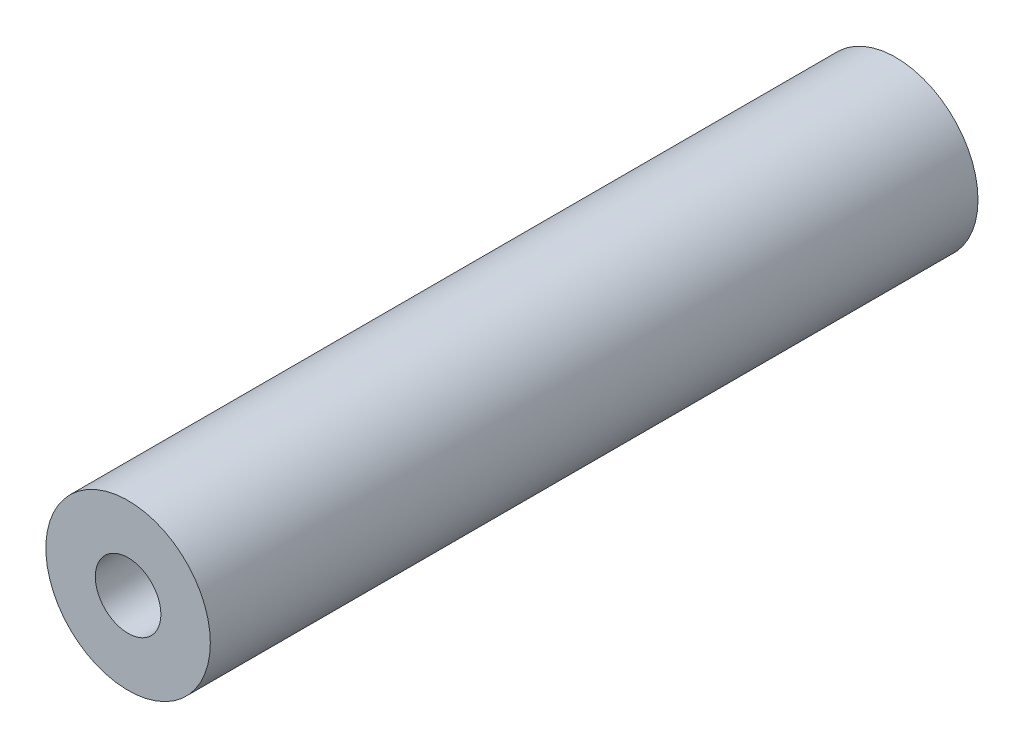
ISO-10303-21;
HEADER;
FILE_DESCRIPTION(('STEP AP214'),'2;1');
FILE_NAME('part.step','',(''),(''),'','','');
FILE_SCHEMA(('AUTOMOTIVE_DESIGN { 1 0 10303 214 1 1 1 1 }'));
ENDSEC;
DATA;
#1=APPLICATION_CONTEXT('core data for automotive mechanical design processes');
#2=APPLICATION_PROTOCOL_DEFINITION('international standard','automotive_design',2000,#1);
#3=PRODUCT_CONTEXT('',#1,'mechanical');
#4=PRODUCT('Part','Part','',(#3));
#5=PRODUCT_RELATED_PRODUCT_CATEGORY('part','',(#4));
#6=PRODUCT_DEFINITION_FORMATION('','',#4);
#7=PRODUCT_DEFINITION_CONTEXT('part definition',#1,'design');
#8=PRODUCT_DEFINITION('design','',#6,#7);
#9=PRODUCT_DEFINITION_SHAPE('','',#8);
#10=(LENGTH_UNIT() NAMED_UNIT(*) SI_UNIT(.MILLI.,.METRE.));
#11=(NAMED_UNIT(*) PLANE_ANGLE_UNIT() SI_UNIT($,.RADIAN.));
#12=(NAMED_UNIT(*) SI_UNIT($,.STERADIAN.) SOLID_ANGLE_UNIT());
#13=UNCERTAINTY_MEASURE_WITH_UNIT(LENGTH_MEASURE(1.E-05),#10,'distance_accuracy_value','');
#14=(GEOMETRIC_REPRESENTATION_CONTEXT(3) GLOBAL_UNCERTAINTY_ASSIGNED_CONTEXT((#13)) GLOBAL_UNIT_ASSIGNED_CONTEXT((#10,
#11,#12)) REPRESENTATION_CONTEXT('',''));
#15=CARTESIAN_POINT('',(0.,0.,0.));
#16=DIRECTION('',(0.,0.,1.));
#17=DIRECTION('',(1.,0.,0.));
#18=AXIS2_PLACEMENT_3D('',#15,#16,#17);
#19=CARTESIAN_POINT('',(0.,0.,22.225));
#20=DIRECTION('',(0.,0.,-1.));
#21=DIRECTION('',(-1.,0.,0.));
#22=AXIS2_PLACEMENT_3D('',#19,#20,#21);
#23=CYLINDRICAL_SURFACE('',#22,4.7625);
#24=CARTESIAN_POINT('',(0.,0.,22.225));
#25=DIRECTION('',(0.,0.,1.));
#26=DIRECTION('',(1.,0.,0.));
#27=AXIS2_PLACEMENT_3D('',#24,#25,#26);
#28=CIRCLE('',#27,4.7625);
#29=CARTESIAN_POINT('',(4.7625,0.,22.225));
#30=VERTEX_POINT('',#29);
#31=EDGE_CURVE('E11',#30,#30,#28,.T.);
#32=ORIENTED_EDGE('',*,*,#31,.F.);
#33=EDGE_LOOP('',(#32));
#34=FACE_BOUND('',#33,.T.);
#35=CARTESIAN_POINT('',(0.,0.,-22.225));
#36=DIRECTION('',(0.,0.,1.));
#37=DIRECTION('',(1.,0.,0.));
#38=AXIS2_PLACEMENT_3D('',#35,#36,#37);
#39=CIRCLE('',#38,4.7625);
#40=CARTESIAN_POINT('',(4.7625,0.,-22.225));
#41=VERTEX_POINT('',#40);
#42=EDGE_CURVE('E48',#41,#41,#39,.T.);
#43=ORIENTED_EDGE('',*,*,#42,.T.);
#44=EDGE_LOOP('',(#43));
#45=FACE_BOUND('',#44,.T.);
#46=ADVANCED_FACE('F45',(#34,#45),#23,.T.);
#47=CARTESIAN_POINT('',(0.,0.,22.225));
#48=DIRECTION('',(0.,0.,1.));
#49=DIRECTION('',(1.,0.,0.));
#50=AXIS2_PLACEMENT_3D('',#47,#48,#49);
#51=PLANE('',#50);
#52=CARTESIAN_POINT('',(0.,0.,22.225));
#53=DIRECTION('',(0.,0.,1.));
#54=DIRECTION('',(1.,0.,0.));
#55=AXIS2_PLACEMENT_3D('',#52,#53,#54);
#56=CIRCLE('',#55,1.89864999999999);
#57=CARTESIAN_POINT('',(1.89864999999999,0.,22.225));
#58=VERTEX_POINT('',#57);
#59=EDGE_CURVE('E71',#58,#58,#56,.T.);
#60=ORIENTED_EDGE('',*,*,#59,.F.);
#61=EDGE_LOOP('',(#60));
#62=FACE_BOUND('',#61,.T.);
#63=ORIENTED_EDGE('',*,*,#31,.T.);
#64=EDGE_LOOP('',(#63));
#65=FACE_BOUND('',#64,.T.);
#66=ADVANCED_FACE('F93',(#62,#65),#51,.T.);
#67=CARTESIAN_POINT('',(0.,0.,-22.225));
#68=DIRECTION('',(0.,0.,1.));
#69=DIRECTION('',(1.,0.,0.));
#70=AXIS2_PLACEMENT_3D('',#67,#68,#69);
#71=PLANE('',#70);
#72=CARTESIAN_POINT('',(0.,0.,-22.225));
#73=DIRECTION('',(0.,0.,-1.));
#74=DIRECTION('',(-1.,0.,0.));
#75=AXIS2_PLACEMENT_3D('',#72,#73,#74);
#76=CIRCLE('',#75,1.89864999999999);
#77=CARTESIAN_POINT('',(-1.89864999999999,0.,-22.225));
#78=VERTEX_POINT('',#77);
#79=EDGE_CURVE('E70',#78,#78,#76,.T.);
#80=ORIENTED_EDGE('',*,*,#79,.F.);
#81=EDGE_LOOP('',(#80));
#82=FACE_BOUND('',#81,.T.);
#83=ORIENTED_EDGE('',*,*,#42,.F.);
#84=EDGE_LOOP('',(#83));
#85=FACE_BOUND('',#84,.T.);
#86=ADVANCED_FACE('F90',(#82,#85),#71,.F.);
#87=CARTESIAN_POINT('',(0.,0.,-9.271));
#88=DIRECTION('',(0.,0.,-1.));
#89=DIRECTION('',(-1.,0.,0.));
#90=AXIS2_PLACEMENT_3D('',#87,#88,#89);
#91=CONICAL_SURFACE('',#90,1.89864999999999,1.02974425867665);
#92=CARTESIAN_POINT('',(0.,0.,-8.13017598568333));
#93=VERTEX_POINT('',#92);
#94=VERTEX_LOOP('',#93);
#95=FACE_BOUND('',#94,.T.);
#96=CARTESIAN_POINT('',(0.,0.,-9.271));
#97=DIRECTION('',(0.,0.,-1.));
#98=DIRECTION('',(-1.,0.,0.));
#99=AXIS2_PLACEMENT_3D('',#96,#97,#98);
#100=CIRCLE('',#99,1.89864999999999);
#101=CARTESIAN_POINT('',(-1.89864999999999,0.,-9.271));
#102=VERTEX_POINT('',#101);
#103=EDGE_CURVE('E76',#102,#102,#100,.T.);
#104=ORIENTED_EDGE('',*,*,#103,.T.);
#105=EDGE_LOOP('',(#104));
#106=FACE_BOUND('',#105,.T.);
#107=ADVANCED_FACE('F92',(#95,#106),#91,.F.);
#108=CARTESIAN_POINT('',(0.,0.,-22.225));
#109=DIRECTION('',(0.,0.,-1.));
#110=DIRECTION('',(-1.,0.,0.));
#111=AXIS2_PLACEMENT_3D('',#108,#109,#110);
#112=CYLINDRICAL_SURFACE('',#111,1.89864999999999);
#113=ORIENTED_EDGE('',*,*,#103,.F.);
#114=EDGE_LOOP('',(#113));
#115=FACE_BOUND('',#114,.T.);
#116=ORIENTED_EDGE('',*,*,#79,.T.);
#117=EDGE_LOOP('',(#116));
#118=FACE_BOUND('',#117,.T.);
#119=ADVANCED_FACE('F63',(#115,#118),#112,.F.);
#120=CARTESIAN_POINT('',(0.,0.,9.271));
#121=DIRECTION('',(0.,0.,1.));
#122=DIRECTION('',(1.,0.,0.));
#123=AXIS2_PLACEMENT_3D('',#120,#121,#122);
#124=CONICAL_SURFACE('',#123,1.89864999999999,1.02974425867665);
#125=CARTESIAN_POINT('',(0.,0.,8.13017598568333));
#126=VERTEX_POINT('',#125);
#127=VERTEX_LOOP('',#126);
#128=FACE_BOUND('',#127,.T.);
#129=CARTESIAN_POINT('',(0.,0.,9.271));
#130=DIRECTION('',(0.,0.,1.));
#131=DIRECTION('',(1.,0.,0.));
#132=AXIS2_PLACEMENT_3D('',#129,#130,#131);
#133=CIRCLE('',#132,1.89864999999999);
#134=CARTESIAN_POINT('',(1.89864999999999,0.,9.271));
#135=VERTEX_POINT('',#134);
#136=EDGE_CURVE('E67',#135,#135,#133,.T.);
#137=ORIENTED_EDGE('',*,*,#136,.T.);
#138=EDGE_LOOP('',(#137));
#139=FACE_BOUND('',#138,.T.);
#140=ADVANCED_FACE('F59',(#128,#139),#124,.F.);
#141=CARTESIAN_POINT('',(0.,0.,22.225));
#142=DIRECTION('',(0.,0.,1.));
#143=DIRECTION('',(1.,0.,0.));
#144=AXIS2_PLACEMENT_3D('',#141,#142,#143);
#145=CYLINDRICAL_SURFACE('',#144,1.89864999999999);
#146=ORIENTED_EDGE('',*,*,#136,.F.);
#147=EDGE_LOOP('',(#146));
#148=FACE_BOUND('',#147,.T.);
#149=ORIENTED_EDGE('',*,*,#59,.T.);
#150=EDGE_LOOP('',(#149));
#151=FACE_BOUND('',#150,.T.);
#152=ADVANCED_FACE('F62',(#148,#151),#145,.F.);
#153=CLOSED_SHELL('',(#46,#66,#86,#107,#119,#140,#152));
#154=MANIFOLD_SOLID_BREP('B2',#153);
#155=ADVANCED_BREP_SHAPE_REPRESENTATION('',(#18,#154),#14);
#156=SHAPE_DEFINITION_REPRESENTATION(#9,#155);
ENDSEC;
END-ISO-10303-21;
